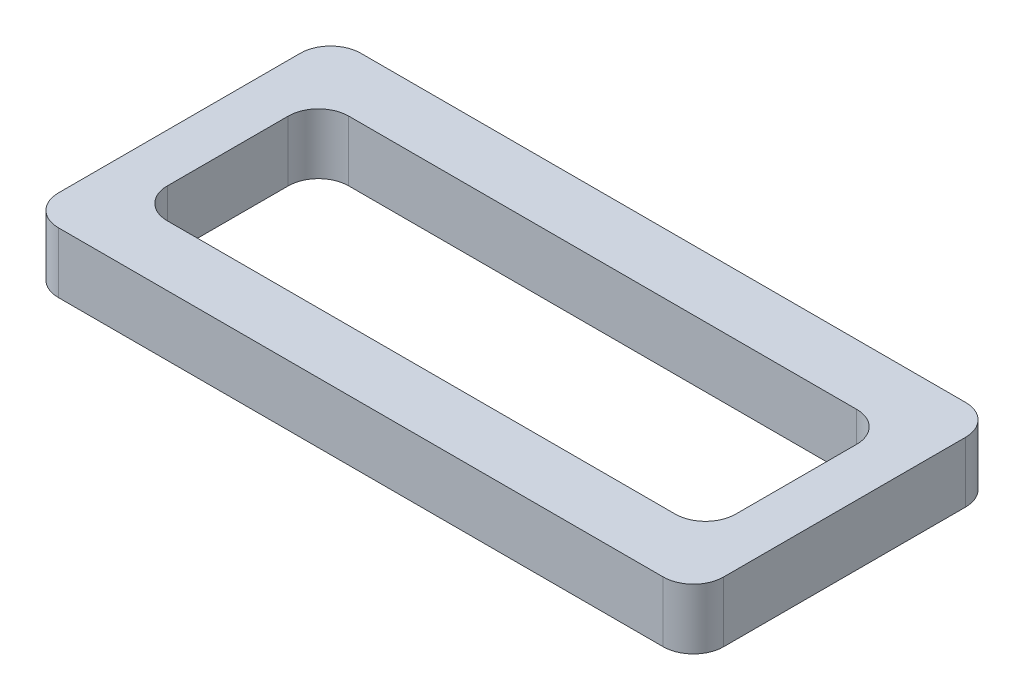
ISO-10303-21;
HEADER;
FILE_DESCRIPTION(('STEP AP214'),'2;1');
FILE_NAME('part.step','',(''),(''),'','','');
FILE_SCHEMA(('AUTOMOTIVE_DESIGN { 1 0 10303 214 1 1 1 1 }'));
ENDSEC;
DATA;
#1=APPLICATION_CONTEXT('core data for automotive mechanical design processes');
#2=APPLICATION_PROTOCOL_DEFINITION('international standard','automotive_design',2000,#1);
#3=PRODUCT_CONTEXT('',#1,'mechanical');
#4=PRODUCT('Part','Part','',(#3));
#5=PRODUCT_RELATED_PRODUCT_CATEGORY('part','',(#4));
#6=PRODUCT_DEFINITION_FORMATION('','',#4);
#7=PRODUCT_DEFINITION_CONTEXT('part definition',#1,'design');
#8=PRODUCT_DEFINITION('design','',#6,#7);
#9=PRODUCT_DEFINITION_SHAPE('','',#8);
#10=(LENGTH_UNIT() NAMED_UNIT(*) SI_UNIT(.MILLI.,.METRE.));
#11=(NAMED_UNIT(*) PLANE_ANGLE_UNIT() SI_UNIT($,.RADIAN.));
#12=(NAMED_UNIT(*) SI_UNIT($,.STERADIAN.) SOLID_ANGLE_UNIT());
#13=UNCERTAINTY_MEASURE_WITH_UNIT(LENGTH_MEASURE(1.E-05),#10,'distance_accuracy_value','');
#14=(GEOMETRIC_REPRESENTATION_CONTEXT(3) GLOBAL_UNCERTAINTY_ASSIGNED_CONTEXT((#13)) GLOBAL_UNIT_ASSIGNED_CONTEXT((#10,
#11,#12)) REPRESENTATION_CONTEXT('',''));
#15=CARTESIAN_POINT('',(0.,0.,0.));
#16=DIRECTION('',(0.,0.,1.));
#17=DIRECTION('',(1.,0.,0.));
#18=AXIS2_PLACEMENT_3D('',#15,#16,#17);
#19=CARTESIAN_POINT('',(0.,10.,0.));
#20=DIRECTION('',(0.,-1.,0.));
#21=DIRECTION('',(0.,0.,-1.));
#22=AXIS2_PLACEMENT_3D('',#19,#20,#21);
#23=PLANE('',#22);
#24=DIRECTION('',(1.,0.,0.));
#25=VECTOR('',#24,1.);
#26=CARTESIAN_POINT('',(-55.,10.,25.));
#27=LINE('',#26,#25);
#28=CARTESIAN_POINT('',(-50.,10.,25.));
#29=VERTEX_POINT('',#28);
#30=CARTESIAN_POINT('',(50.,10.,25.));
#31=VERTEX_POINT('',#30);
#32=EDGE_CURVE('E189',#29,#31,#27,.T.);
#33=ORIENTED_EDGE('',*,*,#32,.T.);
#34=CARTESIAN_POINT('',(50.,10.,20.));
#35=DIRECTION('',(0.,-1.,0.));
#36=DIRECTION('',(0.,0.,-1.));
#37=AXIS2_PLACEMENT_3D('',#34,#35,#36);
#38=CIRCLE('',#37,5.);
#39=CARTESIAN_POINT('',(55.,10.,20.));
#40=VERTEX_POINT('',#39);
#41=EDGE_CURVE('E205',#31,#40,#38,.F.);
#42=ORIENTED_EDGE('',*,*,#41,.T.);
#43=DIRECTION('',(0.,0.,-1.));
#44=VECTOR('',#43,1.);
#45=CARTESIAN_POINT('',(55.,10.,-25.));
#46=LINE('',#45,#44);
#47=CARTESIAN_POINT('',(55.,10.,-20.));
#48=VERTEX_POINT('',#47);
#49=EDGE_CURVE('E170',#40,#48,#46,.T.);
#50=ORIENTED_EDGE('',*,*,#49,.T.);
#51=CARTESIAN_POINT('',(50.,10.,-20.));
#52=DIRECTION('',(0.,-1.,0.));
#53=DIRECTION('',(0.,0.,-1.));
#54=AXIS2_PLACEMENT_3D('',#51,#52,#53);
#55=CIRCLE('',#54,5.);
#56=CARTESIAN_POINT('',(50.,10.,-25.));
#57=VERTEX_POINT('',#56);
#58=EDGE_CURVE('E199',#48,#57,#55,.F.);
#59=ORIENTED_EDGE('',*,*,#58,.T.);
#60=DIRECTION('',(-1.,0.,0.));
#61=VECTOR('',#60,1.);
#62=CARTESIAN_POINT('',(-55.,10.,-25.));
#63=LINE('',#62,#61);
#64=CARTESIAN_POINT('',(-50.,10.,-25.));
#65=VERTEX_POINT('',#64);
#66=EDGE_CURVE('E286',#57,#65,#63,.T.);
#67=ORIENTED_EDGE('',*,*,#66,.T.);
#68=CARTESIAN_POINT('',(-50.,10.,-20.));
#69=DIRECTION('',(0.,-1.,0.));
#70=DIRECTION('',(0.,0.,-1.));
#71=AXIS2_PLACEMENT_3D('',#68,#69,#70);
#72=CIRCLE('',#71,5.);
#73=CARTESIAN_POINT('',(-55.,10.,-20.));
#74=VERTEX_POINT('',#73);
#75=EDGE_CURVE('E201',#65,#74,#72,.F.);
#76=ORIENTED_EDGE('',*,*,#75,.T.);
#77=DIRECTION('',(0.,0.,1.));
#78=VECTOR('',#77,1.);
#79=CARTESIAN_POINT('',(-55.,10.,25.));
#80=LINE('',#79,#78);
#81=CARTESIAN_POINT('',(-55.,10.,20.));
#82=VERTEX_POINT('',#81);
#83=EDGE_CURVE('E190',#74,#82,#80,.T.);
#84=ORIENTED_EDGE('',*,*,#83,.T.);
#85=CARTESIAN_POINT('',(-50.,10.,20.));
#86=DIRECTION('',(0.,-1.,0.));
#87=DIRECTION('',(0.,0.,-1.));
#88=AXIS2_PLACEMENT_3D('',#85,#86,#87);
#89=CIRCLE('',#88,5.);
#90=EDGE_CURVE('E203',#82,#29,#89,.F.);
#91=ORIENTED_EDGE('',*,*,#90,.T.);
#92=EDGE_LOOP('',(#33,#42,#50,#59,#67,#76,#84,#91));
#93=FACE_BOUND('',#92,.T.);
#94=DIRECTION('',(0.,0.,1.));
#95=VECTOR('',#94,1.);
#96=CARTESIAN_POINT('',(-47.,10.,15.));
#97=LINE('',#96,#95);
#98=CARTESIAN_POINT('',(-47.,10.,-9.99999999999999));
#99=VERTEX_POINT('',#98);
#100=CARTESIAN_POINT('',(-47.,10.,10.));
#101=VERTEX_POINT('',#100);
#102=EDGE_CURVE('E267',#99,#101,#97,.T.);
#103=ORIENTED_EDGE('',*,*,#102,.F.);
#104=CARTESIAN_POINT('',(-42.,10.,-9.99999999999999));
#105=DIRECTION('',(0.,-1.,0.));
#106=DIRECTION('',(0.,0.,-1.));
#107=AXIS2_PLACEMENT_3D('',#104,#105,#106);
#108=CIRCLE('',#107,5.);
#109=CARTESIAN_POINT('',(-42.,10.,-15.));
#110=VERTEX_POINT('',#109);
#111=EDGE_CURVE('E11',#99,#110,#108,.T.);
#112=ORIENTED_EDGE('',*,*,#111,.T.);
#113=DIRECTION('',(-1.,0.,0.));
#114=VECTOR('',#113,1.);
#115=CARTESIAN_POINT('',(47.,10.,-15.));
#116=LINE('',#115,#114);
#117=CARTESIAN_POINT('',(42.,10.,-15.));
#118=VERTEX_POINT('',#117);
#119=EDGE_CURVE('E183',#118,#110,#116,.T.);
#120=ORIENTED_EDGE('',*,*,#119,.F.);
#121=CARTESIAN_POINT('',(42.,10.,-10.));
#122=DIRECTION('',(0.,-1.,0.));
#123=DIRECTION('',(0.,0.,-1.));
#124=AXIS2_PLACEMENT_3D('',#121,#122,#123);
#125=CIRCLE('',#124,5.);
#126=CARTESIAN_POINT('',(47.,10.,-10.));
#127=VERTEX_POINT('',#126);
#128=EDGE_CURVE('E241',#118,#127,#125,.T.);
#129=ORIENTED_EDGE('',*,*,#128,.T.);
#130=DIRECTION('',(0.,0.,-1.));
#131=VECTOR('',#130,1.);
#132=CARTESIAN_POINT('',(47.,10.,15.));
#133=LINE('',#132,#131);
#134=CARTESIAN_POINT('',(47.,10.,9.99999999999999));
#135=VERTEX_POINT('',#134);
#136=EDGE_CURVE('E271',#135,#127,#133,.T.);
#137=ORIENTED_EDGE('',*,*,#136,.F.);
#138=CARTESIAN_POINT('',(42.,10.,9.99999999999999));
#139=DIRECTION('',(0.,-1.,0.));
#140=DIRECTION('',(0.,0.,-1.));
#141=AXIS2_PLACEMENT_3D('',#138,#139,#140);
#142=CIRCLE('',#141,5.);
#143=CARTESIAN_POINT('',(42.,10.,15.));
#144=VERTEX_POINT('',#143);
#145=EDGE_CURVE('E51',#135,#144,#142,.T.);
#146=ORIENTED_EDGE('',*,*,#145,.T.);
#147=DIRECTION('',(1.,0.,0.));
#148=VECTOR('',#147,1.);
#149=CARTESIAN_POINT('',(47.,10.,15.));
#150=LINE('',#149,#148);
#151=CARTESIAN_POINT('',(-42.,10.,15.));
#152=VERTEX_POINT('',#151);
#153=EDGE_CURVE('E274',#152,#144,#150,.T.);
#154=ORIENTED_EDGE('',*,*,#153,.F.);
#155=CARTESIAN_POINT('',(-42.,10.,10.));
#156=DIRECTION('',(0.,-1.,0.));
#157=DIRECTION('',(0.,0.,-1.));
#158=AXIS2_PLACEMENT_3D('',#155,#156,#157);
#159=CIRCLE('',#158,5.);
#160=EDGE_CURVE('E245',#152,#101,#159,.T.);
#161=ORIENTED_EDGE('',*,*,#160,.T.);
#162=EDGE_LOOP('',(#103,#112,#120,#129,#137,#146,#154,#161));
#163=FACE_BOUND('',#162,.T.);
#164=ADVANCED_FACE('F36',(#93,#163),#23,.F.);
#165=CARTESIAN_POINT('',(0.,0.,0.));
#166=DIRECTION('',(0.,-1.,0.));
#167=DIRECTION('',(0.,0.,-1.));
#168=AXIS2_PLACEMENT_3D('',#165,#166,#167);
#169=PLANE('',#168);
#170=DIRECTION('',(0.,0.,-1.));
#171=VECTOR('',#170,1.);
#172=CARTESIAN_POINT('',(55.,0.,-25.));
#173=LINE('',#172,#171);
#174=CARTESIAN_POINT('',(55.,0.,20.));
#175=VERTEX_POINT('',#174);
#176=CARTESIAN_POINT('',(55.,0.,-20.));
#177=VERTEX_POINT('',#176);
#178=EDGE_CURVE('E167',#175,#177,#173,.T.);
#179=ORIENTED_EDGE('',*,*,#178,.F.);
#180=CARTESIAN_POINT('',(50.,0.,20.));
#181=DIRECTION('',(0.,-1.,0.));
#182=DIRECTION('',(0.,0.,-1.));
#183=AXIS2_PLACEMENT_3D('',#180,#181,#182);
#184=CIRCLE('',#183,5.);
#185=CARTESIAN_POINT('',(50.,0.,25.));
#186=VERTEX_POINT('',#185);
#187=EDGE_CURVE('E150',#175,#186,#184,.T.);
#188=ORIENTED_EDGE('',*,*,#187,.T.);
#189=DIRECTION('',(1.,0.,0.));
#190=VECTOR('',#189,1.);
#191=CARTESIAN_POINT('',(-55.,0.,25.));
#192=LINE('',#191,#190);
#193=CARTESIAN_POINT('',(-50.,0.,25.));
#194=VERTEX_POINT('',#193);
#195=EDGE_CURVE('E178',#194,#186,#192,.T.);
#196=ORIENTED_EDGE('',*,*,#195,.F.);
#197=CARTESIAN_POINT('',(-50.,0.,20.));
#198=DIRECTION('',(0.,-1.,0.));
#199=DIRECTION('',(0.,0.,-1.));
#200=AXIS2_PLACEMENT_3D('',#197,#198,#199);
#201=CIRCLE('',#200,5.);
#202=CARTESIAN_POINT('',(-55.,0.,20.));
#203=VERTEX_POINT('',#202);
#204=EDGE_CURVE('E161',#194,#203,#201,.T.);
#205=ORIENTED_EDGE('',*,*,#204,.T.);
#206=DIRECTION('',(0.,0.,1.));
#207=VECTOR('',#206,1.);
#208=CARTESIAN_POINT('',(-55.,0.,25.));
#209=LINE('',#208,#207);
#210=CARTESIAN_POINT('',(-55.,0.,-20.));
#211=VERTEX_POINT('',#210);
#212=EDGE_CURVE('E181',#211,#203,#209,.T.);
#213=ORIENTED_EDGE('',*,*,#212,.F.);
#214=CARTESIAN_POINT('',(-50.,0.,-20.));
#215=DIRECTION('',(0.,-1.,0.));
#216=DIRECTION('',(0.,0.,-1.));
#217=AXIS2_PLACEMENT_3D('',#214,#215,#216);
#218=CIRCLE('',#217,5.);
#219=CARTESIAN_POINT('',(-50.,0.,-25.));
#220=VERTEX_POINT('',#219);
#221=EDGE_CURVE('E193',#211,#220,#218,.T.);
#222=ORIENTED_EDGE('',*,*,#221,.T.);
#223=DIRECTION('',(-1.,0.,0.));
#224=VECTOR('',#223,1.);
#225=CARTESIAN_POINT('',(-55.,0.,-25.));
#226=LINE('',#225,#224);
#227=CARTESIAN_POINT('',(50.,0.,-25.));
#228=VERTEX_POINT('',#227);
#229=EDGE_CURVE('E177',#228,#220,#226,.T.);
#230=ORIENTED_EDGE('',*,*,#229,.F.);
#231=CARTESIAN_POINT('',(50.,0.,-20.));
#232=DIRECTION('',(0.,-1.,0.));
#233=DIRECTION('',(0.,0.,-1.));
#234=AXIS2_PLACEMENT_3D('',#231,#232,#233);
#235=CIRCLE('',#234,5.);
#236=EDGE_CURVE('E171',#228,#177,#235,.T.);
#237=ORIENTED_EDGE('',*,*,#236,.T.);
#238=EDGE_LOOP('',(#179,#188,#196,#205,#213,#222,#230,#237));
#239=FACE_BOUND('',#238,.T.);
#240=DIRECTION('',(0.,0.,-1.));
#241=VECTOR('',#240,1.);
#242=CARTESIAN_POINT('',(47.,0.,15.));
#243=LINE('',#242,#241);
#244=CARTESIAN_POINT('',(47.,0.,9.99999999999999));
#245=VERTEX_POINT('',#244);
#246=CARTESIAN_POINT('',(47.,0.,-10.));
#247=VERTEX_POINT('',#246);
#248=EDGE_CURVE('E280',#245,#247,#243,.T.);
#249=ORIENTED_EDGE('',*,*,#248,.T.);
#250=CARTESIAN_POINT('',(42.,0.,-10.));
#251=DIRECTION('',(0.,-1.,0.));
#252=DIRECTION('',(0.,0.,-1.));
#253=AXIS2_PLACEMENT_3D('',#250,#251,#252);
#254=CIRCLE('',#253,5.);
#255=CARTESIAN_POINT('',(42.,0.,-15.));
#256=VERTEX_POINT('',#255);
#257=EDGE_CURVE('E239',#247,#256,#254,.F.);
#258=ORIENTED_EDGE('',*,*,#257,.T.);
#259=DIRECTION('',(-1.,0.,0.));
#260=VECTOR('',#259,1.);
#261=CARTESIAN_POINT('',(47.,0.,-15.));
#262=LINE('',#261,#260);
#263=CARTESIAN_POINT('',(-42.,0.,-15.));
#264=VERTEX_POINT('',#263);
#265=EDGE_CURVE('E252',#256,#264,#262,.T.);
#266=ORIENTED_EDGE('',*,*,#265,.T.);
#267=CARTESIAN_POINT('',(-42.,0.,-9.99999999999999));
#268=DIRECTION('',(0.,-1.,0.));
#269=DIRECTION('',(0.,0.,-1.));
#270=AXIS2_PLACEMENT_3D('',#267,#268,#269);
#271=CIRCLE('',#270,5.);
#272=CARTESIAN_POINT('',(-47.,0.,-9.99999999999999));
#273=VERTEX_POINT('',#272);
#274=EDGE_CURVE('E44',#264,#273,#271,.F.);
#275=ORIENTED_EDGE('',*,*,#274,.T.);
#276=DIRECTION('',(0.,0.,1.));
#277=VECTOR('',#276,1.);
#278=CARTESIAN_POINT('',(-47.,0.,15.));
#279=LINE('',#278,#277);
#280=CARTESIAN_POINT('',(-47.,0.,10.));
#281=VERTEX_POINT('',#280);
#282=EDGE_CURVE('E250',#273,#281,#279,.T.);
#283=ORIENTED_EDGE('',*,*,#282,.T.);
#284=CARTESIAN_POINT('',(-42.,0.,10.));
#285=DIRECTION('',(0.,-1.,0.));
#286=DIRECTION('',(0.,0.,-1.));
#287=AXIS2_PLACEMENT_3D('',#284,#285,#286);
#288=CIRCLE('',#287,5.);
#289=CARTESIAN_POINT('',(-42.,0.,15.));
#290=VERTEX_POINT('',#289);
#291=EDGE_CURVE('E243',#281,#290,#288,.F.);
#292=ORIENTED_EDGE('',*,*,#291,.T.);
#293=DIRECTION('',(1.,0.,0.));
#294=VECTOR('',#293,1.);
#295=CARTESIAN_POINT('',(47.,0.,15.));
#296=LINE('',#295,#294);
#297=CARTESIAN_POINT('',(42.,0.,15.));
#298=VERTEX_POINT('',#297);
#299=EDGE_CURVE('E261',#290,#298,#296,.T.);
#300=ORIENTED_EDGE('',*,*,#299,.T.);
#301=CARTESIAN_POINT('',(42.,0.,9.99999999999999));
#302=DIRECTION('',(0.,-1.,0.));
#303=DIRECTION('',(0.,0.,-1.));
#304=AXIS2_PLACEMENT_3D('',#301,#302,#303);
#305=CIRCLE('',#304,5.);
#306=EDGE_CURVE('E236',#298,#245,#305,.F.);
#307=ORIENTED_EDGE('',*,*,#306,.T.);
#308=EDGE_LOOP('',(#249,#258,#266,#275,#283,#292,#300,#307));
#309=FACE_BOUND('',#308,.T.);
#310=ADVANCED_FACE('F174',(#239,#309),#169,.T.);
#311=CARTESIAN_POINT('',(-55.,10.,25.));
#312=DIRECTION('',(0.,0.,-1.));
#313=DIRECTION('',(-1.,0.,0.));
#314=AXIS2_PLACEMENT_3D('',#311,#312,#313);
#315=PLANE('',#314);
#316=ORIENTED_EDGE('',*,*,#195,.T.);
#317=DIRECTION('',(0.,-1.,0.));
#318=VECTOR('',#317,1.);
#319=CARTESIAN_POINT('',(50.,10.,25.));
#320=LINE('',#319,#318);
#321=EDGE_CURVE('E155',#186,#31,#320,.F.);
#322=ORIENTED_EDGE('',*,*,#321,.T.);
#323=ORIENTED_EDGE('',*,*,#32,.F.);
#324=DIRECTION('',(0.,-1.,0.));
#325=VECTOR('',#324,1.);
#326=CARTESIAN_POINT('',(-50.,10.,25.));
#327=LINE('',#326,#325);
#328=EDGE_CURVE('E160',#29,#194,#327,.T.);
#329=ORIENTED_EDGE('',*,*,#328,.T.);
#330=EDGE_LOOP('',(#316,#322,#323,#329));
#331=FACE_BOUND('',#330,.T.);
#332=ADVANCED_FACE('F301',(#331),#315,.F.);
#333=CARTESIAN_POINT('',(55.,10.,-25.));
#334=DIRECTION('',(-1.,0.,0.));
#335=DIRECTION('',(0.,0.,1.));
#336=AXIS2_PLACEMENT_3D('',#333,#334,#335);
#337=PLANE('',#336);
#338=ORIENTED_EDGE('',*,*,#49,.F.);
#339=DIRECTION('',(0.,-1.,0.));
#340=VECTOR('',#339,1.);
#341=CARTESIAN_POINT('',(55.,10.,20.));
#342=LINE('',#341,#340);
#343=EDGE_CURVE('E154',#40,#175,#342,.T.);
#344=ORIENTED_EDGE('',*,*,#343,.T.);
#345=ORIENTED_EDGE('',*,*,#178,.T.);
#346=DIRECTION('',(0.,-1.,0.));
#347=VECTOR('',#346,1.);
#348=CARTESIAN_POINT('',(55.,10.,-20.));
#349=LINE('',#348,#347);
#350=EDGE_CURVE('E172',#177,#48,#349,.F.);
#351=ORIENTED_EDGE('',*,*,#350,.T.);
#352=EDGE_LOOP('',(#338,#344,#345,#351));
#353=FACE_BOUND('',#352,.T.);
#354=ADVANCED_FACE('F166',(#353),#337,.F.);
#355=CARTESIAN_POINT('',(-55.,10.,-25.));
#356=DIRECTION('',(0.,0.,1.));
#357=DIRECTION('',(1.,0.,0.));
#358=AXIS2_PLACEMENT_3D('',#355,#356,#357);
#359=PLANE('',#358);
#360=ORIENTED_EDGE('',*,*,#229,.T.);
#361=DIRECTION('',(0.,-1.,0.));
#362=VECTOR('',#361,1.);
#363=CARTESIAN_POINT('',(-50.,10.,-25.));
#364=LINE('',#363,#362);
#365=EDGE_CURVE('E215',#220,#65,#364,.F.);
#366=ORIENTED_EDGE('',*,*,#365,.T.);
#367=ORIENTED_EDGE('',*,*,#66,.F.);
#368=DIRECTION('',(0.,-1.,0.));
#369=VECTOR('',#368,1.);
#370=CARTESIAN_POINT('',(50.,10.,-25.));
#371=LINE('',#370,#369);
#372=EDGE_CURVE('E212',#57,#228,#371,.T.);
#373=ORIENTED_EDGE('',*,*,#372,.T.);
#374=EDGE_LOOP('',(#360,#366,#367,#373));
#375=FACE_BOUND('',#374,.T.);
#376=ADVANCED_FACE('F308',(#375),#359,.F.);
#377=CARTESIAN_POINT('',(-55.,10.,25.));
#378=DIRECTION('',(1.,0.,0.));
#379=DIRECTION('',(0.,0.,-1.));
#380=AXIS2_PLACEMENT_3D('',#377,#378,#379);
#381=PLANE('',#380);
#382=ORIENTED_EDGE('',*,*,#212,.T.);
#383=DIRECTION('',(0.,-1.,0.));
#384=VECTOR('',#383,1.);
#385=CARTESIAN_POINT('',(-55.,10.,20.));
#386=LINE('',#385,#384);
#387=EDGE_CURVE('E210',#203,#82,#386,.F.);
#388=ORIENTED_EDGE('',*,*,#387,.T.);
#389=ORIENTED_EDGE('',*,*,#83,.F.);
#390=DIRECTION('',(0.,-1.,0.));
#391=VECTOR('',#390,1.);
#392=CARTESIAN_POINT('',(-55.,10.,-20.));
#393=LINE('',#392,#391);
#394=EDGE_CURVE('E207',#74,#211,#393,.T.);
#395=ORIENTED_EDGE('',*,*,#394,.T.);
#396=EDGE_LOOP('',(#382,#388,#389,#395));
#397=FACE_BOUND('',#396,.T.);
#398=ADVANCED_FACE('F303',(#397),#381,.F.);
#399=CARTESIAN_POINT('',(-47.,10.,15.));
#400=DIRECTION('',(1.,0.,0.));
#401=DIRECTION('',(0.,0.,-1.));
#402=AXIS2_PLACEMENT_3D('',#399,#400,#401);
#403=PLANE('',#402);
#404=ORIENTED_EDGE('',*,*,#102,.T.);
#405=DIRECTION('',(0.,-1.,0.));
#406=VECTOR('',#405,1.);
#407=CARTESIAN_POINT('',(-47.,0.,10.));
#408=LINE('',#407,#406);
#409=EDGE_CURVE('E233',#101,#281,#408,.T.);
#410=ORIENTED_EDGE('',*,*,#409,.T.);
#411=ORIENTED_EDGE('',*,*,#282,.F.);
#412=DIRECTION('',(0.,-1.,0.));
#413=VECTOR('',#412,1.);
#414=CARTESIAN_POINT('',(-47.,10.,-9.99999999999999));
#415=LINE('',#414,#413);
#416=EDGE_CURVE('E231',#273,#99,#415,.F.);
#417=ORIENTED_EDGE('',*,*,#416,.T.);
#418=EDGE_LOOP('',(#404,#410,#411,#417));
#419=FACE_BOUND('',#418,.T.);
#420=ADVANCED_FACE('F258',(#419),#403,.T.);
#421=CARTESIAN_POINT('',(47.,10.,15.));
#422=DIRECTION('',(0.,0.,-1.));
#423=DIRECTION('',(-1.,0.,0.));
#424=AXIS2_PLACEMENT_3D('',#421,#422,#423);
#425=PLANE('',#424);
#426=ORIENTED_EDGE('',*,*,#153,.T.);
#427=DIRECTION('',(0.,-1.,0.));
#428=VECTOR('',#427,1.);
#429=CARTESIAN_POINT('',(42.,0.,15.));
#430=LINE('',#429,#428);
#431=EDGE_CURVE('E218',#144,#298,#430,.T.);
#432=ORIENTED_EDGE('',*,*,#431,.T.);
#433=ORIENTED_EDGE('',*,*,#299,.F.);
#434=DIRECTION('',(0.,-1.,0.));
#435=VECTOR('',#434,1.);
#436=CARTESIAN_POINT('',(-42.,10.,15.));
#437=LINE('',#436,#435);
#438=EDGE_CURVE('E58',#290,#152,#437,.F.);
#439=ORIENTED_EDGE('',*,*,#438,.T.);
#440=EDGE_LOOP('',(#426,#432,#433,#439));
#441=FACE_BOUND('',#440,.T.);
#442=ADVANCED_FACE('F396',(#441),#425,.T.);
#443=CARTESIAN_POINT('',(47.,10.,15.));
#444=DIRECTION('',(-1.,0.,0.));
#445=DIRECTION('',(0.,0.,1.));
#446=AXIS2_PLACEMENT_3D('',#443,#444,#445);
#447=PLANE('',#446);
#448=ORIENTED_EDGE('',*,*,#248,.F.);
#449=DIRECTION('',(0.,-1.,0.));
#450=VECTOR('',#449,1.);
#451=CARTESIAN_POINT('',(47.,10.,9.99999999999999));
#452=LINE('',#451,#450);
#453=EDGE_CURVE('E224',#245,#135,#452,.F.);
#454=ORIENTED_EDGE('',*,*,#453,.T.);
#455=ORIENTED_EDGE('',*,*,#136,.T.);
#456=DIRECTION('',(0.,-1.,0.));
#457=VECTOR('',#456,1.);
#458=CARTESIAN_POINT('',(47.,0.,-10.));
#459=LINE('',#458,#457);
#460=EDGE_CURVE('E221',#127,#247,#459,.T.);
#461=ORIENTED_EDGE('',*,*,#460,.T.);
#462=EDGE_LOOP('',(#448,#454,#455,#461));
#463=FACE_BOUND('',#462,.T.);
#464=ADVANCED_FACE('F400',(#463),#447,.T.);
#465=CARTESIAN_POINT('',(47.,10.,-15.));
#466=DIRECTION('',(0.,0.,1.));
#467=DIRECTION('',(1.,0.,0.));
#468=AXIS2_PLACEMENT_3D('',#465,#466,#467);
#469=PLANE('',#468);
#470=ORIENTED_EDGE('',*,*,#265,.F.);
#471=DIRECTION('',(0.,-1.,0.));
#472=VECTOR('',#471,1.);
#473=CARTESIAN_POINT('',(42.,10.,-15.));
#474=LINE('',#473,#472);
#475=EDGE_CURVE('E229',#256,#118,#474,.F.);
#476=ORIENTED_EDGE('',*,*,#475,.T.);
#477=ORIENTED_EDGE('',*,*,#119,.T.);
#478=DIRECTION('',(0.,-1.,0.));
#479=VECTOR('',#478,1.);
#480=CARTESIAN_POINT('',(-42.,0.,-15.));
#481=LINE('',#480,#479);
#482=EDGE_CURVE('E226',#110,#264,#481,.T.);
#483=ORIENTED_EDGE('',*,*,#482,.T.);
#484=EDGE_LOOP('',(#470,#476,#477,#483));
#485=FACE_BOUND('',#484,.T.);
#486=ADVANCED_FACE('F269',(#485),#469,.T.);
#487=CARTESIAN_POINT('',(50.,10.,20.));
#488=DIRECTION('',(0.,-1.,0.));
#489=DIRECTION('',(0.,0.,-1.));
#490=AXIS2_PLACEMENT_3D('',#487,#488,#489);
#491=CYLINDRICAL_SURFACE('',#490,5.);
#492=ORIENTED_EDGE('',*,*,#41,.F.);
#493=ORIENTED_EDGE('',*,*,#321,.F.);
#494=ORIENTED_EDGE('',*,*,#187,.F.);
#495=ORIENTED_EDGE('',*,*,#343,.F.);
#496=EDGE_LOOP('',(#492,#493,#494,#495));
#497=FACE_BOUND('',#496,.T.);
#498=ADVANCED_FACE('F153',(#497),#491,.T.);
#499=CARTESIAN_POINT('',(-50.,10.,20.));
#500=DIRECTION('',(0.,-1.,0.));
#501=DIRECTION('',(0.,0.,-1.));
#502=AXIS2_PLACEMENT_3D('',#499,#500,#501);
#503=CYLINDRICAL_SURFACE('',#502,5.);
#504=ORIENTED_EDGE('',*,*,#90,.F.);
#505=ORIENTED_EDGE('',*,*,#387,.F.);
#506=ORIENTED_EDGE('',*,*,#204,.F.);
#507=ORIENTED_EDGE('',*,*,#328,.F.);
#508=EDGE_LOOP('',(#504,#505,#506,#507));
#509=FACE_BOUND('',#508,.T.);
#510=ADVANCED_FACE('F299',(#509),#503,.T.);
#511=CARTESIAN_POINT('',(-50.,10.,-20.));
#512=DIRECTION('',(0.,-1.,0.));
#513=DIRECTION('',(0.,0.,-1.));
#514=AXIS2_PLACEMENT_3D('',#511,#512,#513);
#515=CYLINDRICAL_SURFACE('',#514,5.);
#516=ORIENTED_EDGE('',*,*,#75,.F.);
#517=ORIENTED_EDGE('',*,*,#365,.F.);
#518=ORIENTED_EDGE('',*,*,#221,.F.);
#519=ORIENTED_EDGE('',*,*,#394,.F.);
#520=EDGE_LOOP('',(#516,#517,#518,#519));
#521=FACE_BOUND('',#520,.T.);
#522=ADVANCED_FACE('F305',(#521),#515,.T.);
#523=CARTESIAN_POINT('',(50.,10.,-20.));
#524=DIRECTION('',(0.,-1.,0.));
#525=DIRECTION('',(0.,0.,-1.));
#526=AXIS2_PLACEMENT_3D('',#523,#524,#525);
#527=CYLINDRICAL_SURFACE('',#526,5.);
#528=ORIENTED_EDGE('',*,*,#58,.F.);
#529=ORIENTED_EDGE('',*,*,#350,.F.);
#530=ORIENTED_EDGE('',*,*,#236,.F.);
#531=ORIENTED_EDGE('',*,*,#372,.F.);
#532=EDGE_LOOP('',(#528,#529,#530,#531));
#533=FACE_BOUND('',#532,.T.);
#534=ADVANCED_FACE('F313',(#533),#527,.T.);
#535=CARTESIAN_POINT('',(42.,10.,9.99999999999999));
#536=DIRECTION('',(0.,1.,0.));
#537=DIRECTION('',(0.,0.,1.));
#538=AXIS2_PLACEMENT_3D('',#535,#536,#537);
#539=CYLINDRICAL_SURFACE('',#538,5.);
#540=ORIENTED_EDGE('',*,*,#145,.F.);
#541=ORIENTED_EDGE('',*,*,#453,.F.);
#542=ORIENTED_EDGE('',*,*,#306,.F.);
#543=ORIENTED_EDGE('',*,*,#431,.F.);
#544=EDGE_LOOP('',(#540,#541,#542,#543));
#545=FACE_BOUND('',#544,.T.);
#546=ADVANCED_FACE('F315',(#545),#539,.F.);
#547=CARTESIAN_POINT('',(42.,10.,-10.));
#548=DIRECTION('',(0.,1.,0.));
#549=DIRECTION('',(0.,0.,1.));
#550=AXIS2_PLACEMENT_3D('',#547,#548,#549);
#551=CYLINDRICAL_SURFACE('',#550,5.);
#552=ORIENTED_EDGE('',*,*,#128,.F.);
#553=ORIENTED_EDGE('',*,*,#475,.F.);
#554=ORIENTED_EDGE('',*,*,#257,.F.);
#555=ORIENTED_EDGE('',*,*,#460,.F.);
#556=EDGE_LOOP('',(#552,#553,#554,#555));
#557=FACE_BOUND('',#556,.T.);
#558=ADVANCED_FACE('F321',(#557),#551,.F.);
#559=CARTESIAN_POINT('',(-42.,10.,10.));
#560=DIRECTION('',(0.,1.,0.));
#561=DIRECTION('',(0.,0.,1.));
#562=AXIS2_PLACEMENT_3D('',#559,#560,#561);
#563=CYLINDRICAL_SURFACE('',#562,5.);
#564=ORIENTED_EDGE('',*,*,#160,.F.);
#565=ORIENTED_EDGE('',*,*,#438,.F.);
#566=ORIENTED_EDGE('',*,*,#291,.F.);
#567=ORIENTED_EDGE('',*,*,#409,.F.);
#568=EDGE_LOOP('',(#564,#565,#566,#567));
#569=FACE_BOUND('',#568,.T.);
#570=ADVANCED_FACE('F373',(#569),#563,.F.);
#571=CARTESIAN_POINT('',(-42.,10.,-9.99999999999999));
#572=DIRECTION('',(0.,1.,0.));
#573=DIRECTION('',(0.,0.,1.));
#574=AXIS2_PLACEMENT_3D('',#571,#572,#573);
#575=CYLINDRICAL_SURFACE('',#574,5.);
#576=ORIENTED_EDGE('',*,*,#111,.F.);
#577=ORIENTED_EDGE('',*,*,#416,.F.);
#578=ORIENTED_EDGE('',*,*,#274,.F.);
#579=ORIENTED_EDGE('',*,*,#482,.F.);
#580=EDGE_LOOP('',(#576,#577,#578,#579));
#581=FACE_BOUND('',#580,.T.);
#582=ADVANCED_FACE('F38',(#581),#575,.F.);
#583=CLOSED_SHELL('',(#164,#310,#332,#354,#376,#398,#420,#442,#464,#486,#498,#510,#522,#534,
#546,#558,#570,#582));
#584=MANIFOLD_SOLID_BREP('B2',#583);
#585=ADVANCED_BREP_SHAPE_REPRESENTATION('',(#18,#584),#14);
#586=SHAPE_DEFINITION_REPRESENTATION(#9,#585);
ENDSEC;
END-ISO-10303-21;
